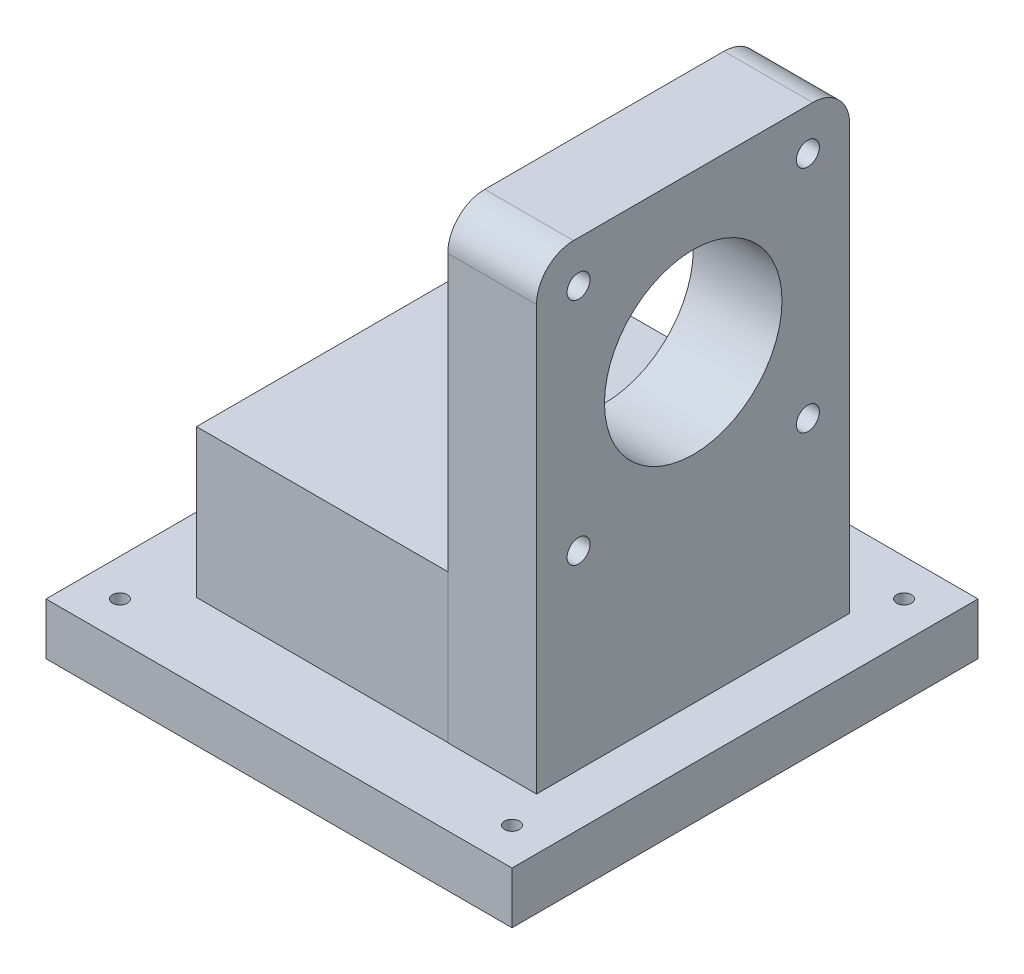
ISO-10303-21;
HEADER;
FILE_DESCRIPTION(('STEP AP214'),'2;1');
FILE_NAME('part.step','',(''),(''),'','','');
FILE_SCHEMA(('AUTOMOTIVE_DESIGN { 1 0 10303 214 1 1 1 1 }'));
ENDSEC;
DATA;
#1=APPLICATION_CONTEXT('core data for automotive mechanical design processes');
#2=APPLICATION_PROTOCOL_DEFINITION('international standard','automotive_design',2000,#1);
#3=PRODUCT_CONTEXT('',#1,'mechanical');
#4=PRODUCT('Part','Part','',(#3));
#5=PRODUCT_RELATED_PRODUCT_CATEGORY('part','',(#4));
#6=PRODUCT_DEFINITION_FORMATION('','',#4);
#7=PRODUCT_DEFINITION_CONTEXT('part definition',#1,'design');
#8=PRODUCT_DEFINITION('design','',#6,#7);
#9=PRODUCT_DEFINITION_SHAPE('','',#8);
#10=(LENGTH_UNIT() NAMED_UNIT(*) SI_UNIT(.MILLI.,.METRE.));
#11=(NAMED_UNIT(*) PLANE_ANGLE_UNIT() SI_UNIT($,.RADIAN.));
#12=(NAMED_UNIT(*) SI_UNIT($,.STERADIAN.) SOLID_ANGLE_UNIT());
#13=UNCERTAINTY_MEASURE_WITH_UNIT(LENGTH_MEASURE(1.E-05),#10,'distance_accuracy_value','');
#14=(GEOMETRIC_REPRESENTATION_CONTEXT(3) GLOBAL_UNCERTAINTY_ASSIGNED_CONTEXT((#13)) GLOBAL_UNIT_ASSIGNED_CONTEXT((#10,
#11,#12)) REPRESENTATION_CONTEXT('',''));
#15=CARTESIAN_POINT('',(0.,0.,0.));
#16=DIRECTION('',(0.,0.,1.));
#17=DIRECTION('',(1.,0.,0.));
#18=AXIS2_PLACEMENT_3D('',#15,#16,#17);
#19=CARTESIAN_POINT('',(0.,7.,0.));
#20=DIRECTION('',(0.,-1.,0.));
#21=DIRECTION('',(0.,0.,-1.));
#22=AXIS2_PLACEMENT_3D('',#19,#20,#21);
#23=PLANE('',#22);
#24=CARTESIAN_POINT('',(-22.,7.,26.5));
#25=DIRECTION('',(0.,1.,0.));
#26=DIRECTION('',(0.,0.,1.));
#27=AXIS2_PLACEMENT_3D('',#24,#25,#26);
#28=CIRCLE('',#27,1.);
#29=CARTESIAN_POINT('',(-22.,7.,27.5));
#30=VERTEX_POINT('',#29);
#31=EDGE_CURVE('E479',#30,#30,#28,.T.);
#32=ORIENTED_EDGE('',*,*,#31,.F.);
#33=EDGE_LOOP('',(#32));
#34=FACE_BOUND('',#33,.T.);
#35=CARTESIAN_POINT('',(31.,7.,26.5));
#36=DIRECTION('',(0.,1.,0.));
#37=DIRECTION('',(0.,0.,1.));
#38=AXIS2_PLACEMENT_3D('',#35,#36,#37);
#39=CIRCLE('',#38,0.999999999999995);
#40=CARTESIAN_POINT('',(31.,7.,27.5));
#41=VERTEX_POINT('',#40);
#42=EDGE_CURVE('E483',#41,#41,#39,.T.);
#43=ORIENTED_EDGE('',*,*,#42,.F.);
#44=EDGE_LOOP('',(#43));
#45=FACE_BOUND('',#44,.T.);
#46=CARTESIAN_POINT('',(31.,7.,-26.5));
#47=DIRECTION('',(0.,1.,0.));
#48=DIRECTION('',(0.,0.,1.));
#49=AXIS2_PLACEMENT_3D('',#46,#47,#48);
#50=CIRCLE('',#49,0.999999999999995);
#51=CARTESIAN_POINT('',(31.,7.,-25.5));
#52=VERTEX_POINT('',#51);
#53=EDGE_CURVE('E495',#52,#52,#50,.T.);
#54=ORIENTED_EDGE('',*,*,#53,.F.);
#55=EDGE_LOOP('',(#54));
#56=FACE_BOUND('',#55,.T.);
#57=CARTESIAN_POINT('',(-22.,7.,-26.5));
#58=DIRECTION('',(0.,1.,0.));
#59=DIRECTION('',(0.,0.,1.));
#60=AXIS2_PLACEMENT_3D('',#57,#58,#59);
#61=CIRCLE('',#60,1.);
#62=CARTESIAN_POINT('',(-22.,7.,-25.5));
#63=VERTEX_POINT('',#62);
#64=EDGE_CURVE('E488',#63,#63,#61,.T.);
#65=ORIENTED_EDGE('',*,*,#64,.F.);
#66=EDGE_LOOP('',(#65));
#67=FACE_BOUND('',#66,.T.);
#68=DIRECTION('',(0.,0.,-1.));
#69=VECTOR('',#68,1.);
#70=CARTESIAN_POINT('',(36.,7.,31.5));
#71=LINE('',#70,#69);
#72=CARTESIAN_POINT('',(36.,7.,31.5));
#73=VERTEX_POINT('',#72);
#74=CARTESIAN_POINT('',(36.,7.,-31.5));
#75=VERTEX_POINT('',#74);
#76=EDGE_CURVE('E189',#73,#75,#71,.T.);
#77=ORIENTED_EDGE('',*,*,#76,.T.);
#78=DIRECTION('',(-1.,0.,0.));
#79=VECTOR('',#78,1.);
#80=CARTESIAN_POINT('',(-27.,7.,-31.5));
#81=LINE('',#80,#79);
#82=CARTESIAN_POINT('',(-27.,7.,-31.5));
#83=VERTEX_POINT('',#82);
#84=EDGE_CURVE('E192',#75,#83,#81,.T.);
#85=ORIENTED_EDGE('',*,*,#84,.T.);
#86=DIRECTION('',(0.,0.,1.));
#87=VECTOR('',#86,1.);
#88=CARTESIAN_POINT('',(-27.,7.,31.5));
#89=LINE('',#88,#87);
#90=CARTESIAN_POINT('',(-27.,7.,31.5));
#91=VERTEX_POINT('',#90);
#92=EDGE_CURVE('E195',#83,#91,#89,.T.);
#93=ORIENTED_EDGE('',*,*,#92,.T.);
#94=DIRECTION('',(1.,0.,0.));
#95=VECTOR('',#94,1.);
#96=CARTESIAN_POINT('',(-27.,7.,31.5));
#97=LINE('',#96,#95);
#98=EDGE_CURVE('E197',#91,#73,#97,.T.);
#99=ORIENTED_EDGE('',*,*,#98,.T.);
#100=EDGE_LOOP('',(#77,#85,#93,#99));
#101=FACE_BOUND('',#100,.T.);
#102=DIRECTION('',(0.,0.,1.));
#103=VECTOR('',#102,1.);
#104=CARTESIAN_POINT('',(17.,7.,-21.15));
#105=LINE('',#104,#103);
#106=CARTESIAN_POINT('',(17.,7.,21.15));
#107=VERTEX_POINT('',#106);
#108=CARTESIAN_POINT('',(17.,7.,21.185));
#109=VERTEX_POINT('',#108);
#110=EDGE_CURVE('E141',#107,#109,#105,.T.);
#111=ORIENTED_EDGE('',*,*,#110,.F.);
#112=DIRECTION('',(1.,0.,0.));
#113=VECTOR('',#112,1.);
#114=CARTESIAN_POINT('',(-17.,7.,21.15));
#115=LINE('',#114,#113);
#116=CARTESIAN_POINT('',(-17.,7.,21.15));
#117=VERTEX_POINT('',#116);
#118=EDGE_CURVE('E168',#117,#107,#115,.T.);
#119=ORIENTED_EDGE('',*,*,#118,.F.);
#120=DIRECTION('',(0.,0.,1.));
#121=VECTOR('',#120,1.);
#122=CARTESIAN_POINT('',(-17.,7.,21.15));
#123=LINE('',#122,#121);
#124=CARTESIAN_POINT('',(-17.,7.,-21.15));
#125=VERTEX_POINT('',#124);
#126=EDGE_CURVE('E177',#125,#117,#123,.T.);
#127=ORIENTED_EDGE('',*,*,#126,.F.);
#128=DIRECTION('',(-1.,0.,0.));
#129=VECTOR('',#128,1.);
#130=CARTESIAN_POINT('',(-17.,7.,-21.15));
#131=LINE('',#130,#129);
#132=CARTESIAN_POINT('',(29.,7.,-21.15));
#133=VERTEX_POINT('',#132);
#134=EDGE_CURVE('E137',#133,#125,#131,.T.);
#135=ORIENTED_EDGE('',*,*,#134,.F.);
#136=DIRECTION('',(0.,0.,-1.));
#137=VECTOR('',#136,1.);
#138=CARTESIAN_POINT('',(29.,7.,-21.15));
#139=LINE('',#138,#137);
#140=CARTESIAN_POINT('',(29.,7.,21.185));
#141=VERTEX_POINT('',#140);
#142=EDGE_CURVE('E152',#141,#133,#139,.T.);
#143=ORIENTED_EDGE('',*,*,#142,.F.);
#144=DIRECTION('',(1.,0.,0.));
#145=VECTOR('',#144,1.);
#146=CARTESIAN_POINT('',(17.,7.,21.185));
#147=LINE('',#146,#145);
#148=EDGE_CURVE('E132',#109,#141,#147,.T.);
#149=ORIENTED_EDGE('',*,*,#148,.F.);
#150=EDGE_LOOP('',(#111,#119,#127,#135,#143,#149));
#151=FACE_BOUND('',#150,.T.);
#152=ADVANCED_FACE('F33',(#34,#45,#56,#67,#101,#151),#23,.F.);
#153=CARTESIAN_POINT('',(36.,7.,31.5));
#154=DIRECTION('',(-1.,0.,0.));
#155=DIRECTION('',(0.,0.,1.));
#156=AXIS2_PLACEMENT_3D('',#153,#154,#155);
#157=PLANE('',#156);
#158=DIRECTION('',(0.,0.,-1.));
#159=VECTOR('',#158,1.);
#160=CARTESIAN_POINT('',(36.,0.,31.5));
#161=LINE('',#160,#159);
#162=CARTESIAN_POINT('',(36.,0.,31.5));
#163=VERTEX_POINT('',#162);
#164=CARTESIAN_POINT('',(36.,0.,-31.5));
#165=VERTEX_POINT('',#164);
#166=EDGE_CURVE('E188',#163,#165,#161,.T.);
#167=ORIENTED_EDGE('',*,*,#166,.T.);
#168=DIRECTION('',(0.,-1.,0.));
#169=VECTOR('',#168,1.);
#170=CARTESIAN_POINT('',(36.,7.,-31.5));
#171=LINE('',#170,#169);
#172=EDGE_CURVE('E215',#75,#165,#171,.T.);
#173=ORIENTED_EDGE('',*,*,#172,.F.);
#174=ORIENTED_EDGE('',*,*,#76,.F.);
#175=DIRECTION('',(0.,-1.,0.));
#176=VECTOR('',#175,1.);
#177=CARTESIAN_POINT('',(36.,7.,31.5));
#178=LINE('',#177,#176);
#179=EDGE_CURVE('E199',#73,#163,#178,.T.);
#180=ORIENTED_EDGE('',*,*,#179,.T.);
#181=EDGE_LOOP('',(#167,#173,#174,#180));
#182=FACE_BOUND('',#181,.T.);
#183=ADVANCED_FACE('F261',(#182),#157,.F.);
#184=CARTESIAN_POINT('',(-27.,7.,-31.5));
#185=DIRECTION('',(0.,0.,1.));
#186=DIRECTION('',(1.,0.,0.));
#187=AXIS2_PLACEMENT_3D('',#184,#185,#186);
#188=PLANE('',#187);
#189=DIRECTION('',(-1.,0.,0.));
#190=VECTOR('',#189,1.);
#191=CARTESIAN_POINT('',(-27.,0.,-31.5));
#192=LINE('',#191,#190);
#193=CARTESIAN_POINT('',(-27.,0.,-31.5));
#194=VERTEX_POINT('',#193);
#195=EDGE_CURVE('E202',#165,#194,#192,.T.);
#196=ORIENTED_EDGE('',*,*,#195,.T.);
#197=DIRECTION('',(0.,-1.,0.));
#198=VECTOR('',#197,1.);
#199=CARTESIAN_POINT('',(-27.,7.,-31.5));
#200=LINE('',#199,#198);
#201=EDGE_CURVE('E212',#83,#194,#200,.T.);
#202=ORIENTED_EDGE('',*,*,#201,.F.);
#203=ORIENTED_EDGE('',*,*,#84,.F.);
#204=ORIENTED_EDGE('',*,*,#172,.T.);
#205=EDGE_LOOP('',(#196,#202,#203,#204));
#206=FACE_BOUND('',#205,.T.);
#207=ADVANCED_FACE('F267',(#206),#188,.F.);
#208=CARTESIAN_POINT('',(-27.,7.,31.5));
#209=DIRECTION('',(1.,0.,0.));
#210=DIRECTION('',(0.,0.,-1.));
#211=AXIS2_PLACEMENT_3D('',#208,#209,#210);
#212=PLANE('',#211);
#213=DIRECTION('',(0.,0.,1.));
#214=VECTOR('',#213,1.);
#215=CARTESIAN_POINT('',(-27.,0.,31.5));
#216=LINE('',#215,#214);
#217=CARTESIAN_POINT('',(-27.,0.,31.5));
#218=VERTEX_POINT('',#217);
#219=EDGE_CURVE('E204',#194,#218,#216,.T.);
#220=ORIENTED_EDGE('',*,*,#219,.T.);
#221=DIRECTION('',(0.,-1.,0.));
#222=VECTOR('',#221,1.);
#223=CARTESIAN_POINT('',(-27.,7.,31.5));
#224=LINE('',#223,#222);
#225=EDGE_CURVE('E209',#91,#218,#224,.T.);
#226=ORIENTED_EDGE('',*,*,#225,.F.);
#227=ORIENTED_EDGE('',*,*,#92,.F.);
#228=ORIENTED_EDGE('',*,*,#201,.T.);
#229=EDGE_LOOP('',(#220,#226,#227,#228));
#230=FACE_BOUND('',#229,.T.);
#231=ADVANCED_FACE('F279',(#230),#212,.F.);
#232=CARTESIAN_POINT('',(-27.,7.,31.5));
#233=DIRECTION('',(0.,0.,-1.));
#234=DIRECTION('',(-1.,0.,0.));
#235=AXIS2_PLACEMENT_3D('',#232,#233,#234);
#236=PLANE('',#235);
#237=DIRECTION('',(1.,0.,0.));
#238=VECTOR('',#237,1.);
#239=CARTESIAN_POINT('',(-27.,0.,31.5));
#240=LINE('',#239,#238);
#241=EDGE_CURVE('E193',#218,#163,#240,.T.);
#242=ORIENTED_EDGE('',*,*,#241,.T.);
#243=ORIENTED_EDGE('',*,*,#179,.F.);
#244=ORIENTED_EDGE('',*,*,#98,.F.);
#245=ORIENTED_EDGE('',*,*,#225,.T.);
#246=EDGE_LOOP('',(#242,#243,#244,#245));
#247=FACE_BOUND('',#246,.T.);
#248=ADVANCED_FACE('F275',(#247),#236,.F.);
#249=CARTESIAN_POINT('',(0.,0.,0.));
#250=DIRECTION('',(0.,-1.,0.));
#251=DIRECTION('',(0.,0.,-1.));
#252=AXIS2_PLACEMENT_3D('',#249,#250,#251);
#253=PLANE('',#252);
#254=CARTESIAN_POINT('',(-22.,0.,26.5));
#255=DIRECTION('',(0.,-1.,0.));
#256=DIRECTION('',(0.,0.,-1.));
#257=AXIS2_PLACEMENT_3D('',#254,#255,#256);
#258=CIRCLE('',#257,1.);
#259=CARTESIAN_POINT('',(-22.,0.,25.5));
#260=VERTEX_POINT('',#259);
#261=EDGE_CURVE('E477',#260,#260,#258,.F.);
#262=ORIENTED_EDGE('',*,*,#261,.T.);
#263=EDGE_LOOP('',(#262));
#264=FACE_BOUND('',#263,.T.);
#265=CARTESIAN_POINT('',(31.,0.,26.5));
#266=DIRECTION('',(0.,-1.,0.));
#267=DIRECTION('',(0.,0.,-1.));
#268=AXIS2_PLACEMENT_3D('',#265,#266,#267);
#269=CIRCLE('',#268,0.999999999999995);
#270=CARTESIAN_POINT('',(31.,0.,25.5));
#271=VERTEX_POINT('',#270);
#272=EDGE_CURVE('E480',#271,#271,#269,.F.);
#273=ORIENTED_EDGE('',*,*,#272,.T.);
#274=EDGE_LOOP('',(#273));
#275=FACE_BOUND('',#274,.T.);
#276=CARTESIAN_POINT('',(31.,0.,-26.5));
#277=DIRECTION('',(0.,-1.,0.));
#278=DIRECTION('',(0.,0.,-1.));
#279=AXIS2_PLACEMENT_3D('',#276,#277,#278);
#280=CIRCLE('',#279,0.999999999999995);
#281=CARTESIAN_POINT('',(31.,0.,-27.5));
#282=VERTEX_POINT('',#281);
#283=EDGE_CURVE('E548',#282,#282,#280,.F.);
#284=ORIENTED_EDGE('',*,*,#283,.T.);
#285=EDGE_LOOP('',(#284));
#286=FACE_BOUND('',#285,.T.);
#287=CARTESIAN_POINT('',(-22.,0.,-26.5));
#288=DIRECTION('',(0.,-1.,0.));
#289=DIRECTION('',(0.,0.,-1.));
#290=AXIS2_PLACEMENT_3D('',#287,#288,#289);
#291=CIRCLE('',#290,1.);
#292=CARTESIAN_POINT('',(-22.,0.,-27.5));
#293=VERTEX_POINT('',#292);
#294=EDGE_CURVE('E492',#293,#293,#291,.F.);
#295=ORIENTED_EDGE('',*,*,#294,.T.);
#296=EDGE_LOOP('',(#295));
#297=FACE_BOUND('',#296,.T.);
#298=ORIENTED_EDGE('',*,*,#166,.F.);
#299=ORIENTED_EDGE('',*,*,#241,.F.);
#300=ORIENTED_EDGE('',*,*,#219,.F.);
#301=ORIENTED_EDGE('',*,*,#195,.F.);
#302=EDGE_LOOP('',(#298,#299,#300,#301));
#303=FACE_BOUND('',#302,.T.);
#304=ADVANCED_FACE('F258',(#264,#275,#286,#297,#303),#253,.T.);
#305=CARTESIAN_POINT('',(-17.,27.,-21.15));
#306=DIRECTION('',(0.,0.,1.));
#307=DIRECTION('',(1.,0.,0.));
#308=AXIS2_PLACEMENT_3D('',#305,#306,#307);
#309=PLANE('',#308);
#310=DIRECTION('',(0.,-1.,0.));
#311=VECTOR('',#310,1.);
#312=CARTESIAN_POINT('',(17.,69.3,-21.15));
#313=LINE('',#312,#311);
#314=CARTESIAN_POINT('',(17.,64.3,-21.15));
#315=VERTEX_POINT('',#314);
#316=CARTESIAN_POINT('',(17.,27.,-21.15));
#317=VERTEX_POINT('',#316);
#318=EDGE_CURVE('E158',#315,#317,#313,.T.);
#319=ORIENTED_EDGE('',*,*,#318,.F.);
#320=DIRECTION('',(-1.,0.,0.));
#321=VECTOR('',#320,1.);
#322=CARTESIAN_POINT('',(29.,64.3,-21.15));
#323=LINE('',#322,#321);
#324=CARTESIAN_POINT('',(29.,64.3,-21.15));
#325=VERTEX_POINT('',#324);
#326=EDGE_CURVE('E56',#315,#325,#323,.F.);
#327=ORIENTED_EDGE('',*,*,#326,.T.);
#328=DIRECTION('',(0.,-1.,0.));
#329=VECTOR('',#328,1.);
#330=CARTESIAN_POINT('',(29.,69.3,-21.15));
#331=LINE('',#330,#329);
#332=EDGE_CURVE('E160',#325,#133,#331,.T.);
#333=ORIENTED_EDGE('',*,*,#332,.T.);
#334=ORIENTED_EDGE('',*,*,#134,.T.);
#335=DIRECTION('',(0.,-1.,0.));
#336=VECTOR('',#335,1.);
#337=CARTESIAN_POINT('',(-17.,27.,-21.15));
#338=LINE('',#337,#336);
#339=CARTESIAN_POINT('',(-17.,27.,-21.15));
#340=VERTEX_POINT('',#339);
#341=EDGE_CURVE('E185',#340,#125,#338,.T.);
#342=ORIENTED_EDGE('',*,*,#341,.F.);
#343=DIRECTION('',(-1.,0.,0.));
#344=VECTOR('',#343,1.);
#345=CARTESIAN_POINT('',(-17.,27.,-21.15));
#346=LINE('',#345,#344);
#347=EDGE_CURVE('E167',#317,#340,#346,.T.);
#348=ORIENTED_EDGE('',*,*,#347,.F.);
#349=EDGE_LOOP('',(#319,#327,#333,#334,#342,#348));
#350=FACE_BOUND('',#349,.T.);
#351=ADVANCED_FACE('F240',(#350),#309,.F.);
#352=CARTESIAN_POINT('',(-17.,27.,21.15));
#353=DIRECTION('',(1.,0.,0.));
#354=DIRECTION('',(0.,0.,-1.));
#355=AXIS2_PLACEMENT_3D('',#352,#353,#354);
#356=PLANE('',#355);
#357=ORIENTED_EDGE('',*,*,#126,.T.);
#358=DIRECTION('',(0.,-1.,0.));
#359=VECTOR('',#358,1.);
#360=CARTESIAN_POINT('',(-17.,27.,21.15));
#361=LINE('',#360,#359);
#362=CARTESIAN_POINT('',(-17.,27.,21.15));
#363=VERTEX_POINT('',#362);
#364=EDGE_CURVE('E182',#363,#117,#361,.T.);
#365=ORIENTED_EDGE('',*,*,#364,.F.);
#366=DIRECTION('',(0.,0.,1.));
#367=VECTOR('',#366,1.);
#368=CARTESIAN_POINT('',(-17.,27.,21.15));
#369=LINE('',#368,#367);
#370=EDGE_CURVE('E170',#340,#363,#369,.T.);
#371=ORIENTED_EDGE('',*,*,#370,.F.);
#372=ORIENTED_EDGE('',*,*,#341,.T.);
#373=EDGE_LOOP('',(#357,#365,#371,#372));
#374=FACE_BOUND('',#373,.T.);
#375=ADVANCED_FACE('F250',(#374),#356,.F.);
#376=CARTESIAN_POINT('',(-17.,27.,21.15));
#377=DIRECTION('',(0.,0.,-1.));
#378=DIRECTION('',(-1.,0.,0.));
#379=AXIS2_PLACEMENT_3D('',#376,#377,#378);
#380=PLANE('',#379);
#381=ORIENTED_EDGE('',*,*,#118,.T.);
#382=DIRECTION('',(0.,-1.,0.));
#383=VECTOR('',#382,1.);
#384=CARTESIAN_POINT('',(17.,27.,21.15));
#385=LINE('',#384,#383);
#386=CARTESIAN_POINT('',(17.,27.,21.15));
#387=VERTEX_POINT('',#386);
#388=EDGE_CURVE('E145',#387,#107,#385,.T.);
#389=ORIENTED_EDGE('',*,*,#388,.F.);
#390=DIRECTION('',(1.,0.,0.));
#391=VECTOR('',#390,1.);
#392=CARTESIAN_POINT('',(-17.,27.,21.15));
#393=LINE('',#392,#391);
#394=EDGE_CURVE('E172',#363,#387,#393,.T.);
#395=ORIENTED_EDGE('',*,*,#394,.F.);
#396=ORIENTED_EDGE('',*,*,#364,.T.);
#397=EDGE_LOOP('',(#381,#389,#395,#396));
#398=FACE_BOUND('',#397,.T.);
#399=ADVANCED_FACE('F248',(#398),#380,.F.);
#400=CARTESIAN_POINT('',(0.,27.,0.));
#401=DIRECTION('',(0.,-1.,0.));
#402=DIRECTION('',(0.,0.,-1.));
#403=AXIS2_PLACEMENT_3D('',#400,#401,#402);
#404=PLANE('',#403);
#405=DIRECTION('',(0.,0.,-1.));
#406=VECTOR('',#405,1.);
#407=CARTESIAN_POINT('',(17.,27.,21.15));
#408=LINE('',#407,#406);
#409=EDGE_CURVE('E164',#387,#317,#408,.T.);
#410=ORIENTED_EDGE('',*,*,#409,.T.);
#411=ORIENTED_EDGE('',*,*,#347,.T.);
#412=ORIENTED_EDGE('',*,*,#370,.T.);
#413=ORIENTED_EDGE('',*,*,#394,.T.);
#414=EDGE_LOOP('',(#410,#411,#412,#413));
#415=FACE_BOUND('',#414,.T.);
#416=ADVANCED_FACE('F244',(#415),#404,.F.);
#417=CARTESIAN_POINT('',(17.,69.3,-21.15));
#418=DIRECTION('',(1.,0.,0.));
#419=DIRECTION('',(0.,0.,-1.));
#420=AXIS2_PLACEMENT_3D('',#417,#418,#419);
#421=PLANE('',#420);
#422=CARTESIAN_POINT('',(17.,63.65,15.5));
#423=DIRECTION('',(1.,0.,0.));
#424=DIRECTION('',(0.,0.,-1.));
#425=AXIS2_PLACEMENT_3D('',#422,#423,#424);
#426=CIRCLE('',#425,1.55500000000001);
#427=CARTESIAN_POINT('',(17.,63.65,13.945));
#428=VERTEX_POINT('',#427);
#429=EDGE_CURVE('E148',#428,#428,#426,.T.);
#430=ORIENTED_EDGE('',*,*,#429,.T.);
#431=EDGE_LOOP('',(#430));
#432=FACE_BOUND('',#431,.T.);
#433=CARTESIAN_POINT('',(17.,63.65,-15.5));
#434=DIRECTION('',(1.,0.,0.));
#435=DIRECTION('',(0.,0.,-1.));
#436=AXIS2_PLACEMENT_3D('',#433,#434,#435);
#437=CIRCLE('',#436,1.555);
#438=CARTESIAN_POINT('',(17.,63.65,-17.055));
#439=VERTEX_POINT('',#438);
#440=EDGE_CURVE('E518',#439,#439,#437,.T.);
#441=ORIENTED_EDGE('',*,*,#440,.T.);
#442=EDGE_LOOP('',(#441));
#443=FACE_BOUND('',#442,.T.);
#444=CARTESIAN_POINT('',(17.,32.65,-15.5));
#445=DIRECTION('',(1.,0.,0.));
#446=DIRECTION('',(0.,0.,-1.));
#447=AXIS2_PLACEMENT_3D('',#444,#445,#446);
#448=CIRCLE('',#447,1.555);
#449=CARTESIAN_POINT('',(17.,32.65,-17.055));
#450=VERTEX_POINT('',#449);
#451=EDGE_CURVE('E515',#450,#450,#448,.T.);
#452=ORIENTED_EDGE('',*,*,#451,.T.);
#453=EDGE_LOOP('',(#452));
#454=FACE_BOUND('',#453,.T.);
#455=CARTESIAN_POINT('',(17.,32.65,15.5));
#456=DIRECTION('',(1.,0.,0.));
#457=DIRECTION('',(0.,0.,-1.));
#458=AXIS2_PLACEMENT_3D('',#455,#456,#457);
#459=CIRCLE('',#458,1.555);
#460=CARTESIAN_POINT('',(17.,32.65,13.945));
#461=VERTEX_POINT('',#460);
#462=EDGE_CURVE('E512',#461,#461,#459,.T.);
#463=ORIENTED_EDGE('',*,*,#462,.T.);
#464=EDGE_LOOP('',(#463));
#465=FACE_BOUND('',#464,.T.);
#466=CARTESIAN_POINT('',(17.,48.15,0.));
#467=DIRECTION('',(1.,0.,0.));
#468=DIRECTION('',(0.,0.,-1.));
#469=AXIS2_PLACEMENT_3D('',#466,#467,#468);
#470=CIRCLE('',#469,12.);
#471=CARTESIAN_POINT('',(17.,48.15,-12.));
#472=VERTEX_POINT('',#471);
#473=EDGE_CURVE('E509',#472,#472,#470,.T.);
#474=ORIENTED_EDGE('',*,*,#473,.T.);
#475=EDGE_LOOP('',(#474));
#476=FACE_BOUND('',#475,.T.);
#477=DIRECTION('',(0.,0.,1.));
#478=VECTOR('',#477,1.);
#479=CARTESIAN_POINT('',(17.,69.3,-21.15));
#480=LINE('',#479,#478);
#481=CARTESIAN_POINT('',(17.,69.3,-16.15));
#482=VERTEX_POINT('',#481);
#483=CARTESIAN_POINT('',(17.,69.3,16.185));
#484=VERTEX_POINT('',#483);
#485=EDGE_CURVE('E154',#482,#484,#480,.T.);
#486=ORIENTED_EDGE('',*,*,#485,.F.);
#487=CARTESIAN_POINT('',(17.,64.3,-16.15));
#488=DIRECTION('',(1.,0.,0.));
#489=DIRECTION('',(0.,0.,-1.));
#490=AXIS2_PLACEMENT_3D('',#487,#488,#489);
#491=CIRCLE('',#490,5.);
#492=EDGE_CURVE('E226',#482,#315,#491,.F.);
#493=ORIENTED_EDGE('',*,*,#492,.T.);
#494=ORIENTED_EDGE('',*,*,#318,.T.);
#495=ORIENTED_EDGE('',*,*,#409,.F.);
#496=ORIENTED_EDGE('',*,*,#388,.T.);
#497=ORIENTED_EDGE('',*,*,#110,.T.);
#498=DIRECTION('',(0.,-1.,0.));
#499=VECTOR('',#498,1.);
#500=CARTESIAN_POINT('',(17.,69.3,21.185));
#501=LINE('',#500,#499);
#502=CARTESIAN_POINT('',(17.,64.3,21.185));
#503=VERTEX_POINT('',#502);
#504=EDGE_CURVE('E128',#503,#109,#501,.T.);
#505=ORIENTED_EDGE('',*,*,#504,.F.);
#506=CARTESIAN_POINT('',(17.,64.3,16.185));
#507=DIRECTION('',(1.,0.,0.));
#508=DIRECTION('',(0.,0.,-1.));
#509=AXIS2_PLACEMENT_3D('',#506,#507,#508);
#510=CIRCLE('',#509,5.);
#511=EDGE_CURVE('E224',#503,#484,#510,.F.);
#512=ORIENTED_EDGE('',*,*,#511,.T.);
#513=EDGE_LOOP('',(#486,#493,#494,#495,#496,#497,#505,#512));
#514=FACE_BOUND('',#513,.T.);
#515=ADVANCED_FACE('F143',(#432,#443,#454,#465,#476,#514),#421,.F.);
#516=CARTESIAN_POINT('',(17.,69.3,21.185));
#517=DIRECTION('',(0.,0.,-1.));
#518=DIRECTION('',(-1.,0.,0.));
#519=AXIS2_PLACEMENT_3D('',#516,#517,#518);
#520=PLANE('',#519);
#521=DIRECTION('',(0.,-1.,0.));
#522=VECTOR('',#521,1.);
#523=CARTESIAN_POINT('',(29.,69.3,21.185));
#524=LINE('',#523,#522);
#525=CARTESIAN_POINT('',(29.,64.3,21.185));
#526=VERTEX_POINT('',#525);
#527=EDGE_CURVE('E138',#526,#141,#524,.T.);
#528=ORIENTED_EDGE('',*,*,#527,.F.);
#529=DIRECTION('',(1.,0.,0.));
#530=VECTOR('',#529,1.);
#531=CARTESIAN_POINT('',(17.,64.3,21.185));
#532=LINE('',#531,#530);
#533=EDGE_CURVE('E11',#526,#503,#532,.F.);
#534=ORIENTED_EDGE('',*,*,#533,.T.);
#535=ORIENTED_EDGE('',*,*,#504,.T.);
#536=ORIENTED_EDGE('',*,*,#148,.T.);
#537=EDGE_LOOP('',(#528,#534,#535,#536));
#538=FACE_BOUND('',#537,.T.);
#539=ADVANCED_FACE('F130',(#538),#520,.F.);
#540=CARTESIAN_POINT('',(29.,69.3,-21.15));
#541=DIRECTION('',(-1.,0.,0.));
#542=DIRECTION('',(0.,0.,1.));
#543=AXIS2_PLACEMENT_3D('',#540,#541,#542);
#544=PLANE('',#543);
#545=CARTESIAN_POINT('',(29.,63.65,15.5));
#546=DIRECTION('',(1.,0.,0.));
#547=DIRECTION('',(0.,0.,-1.));
#548=AXIS2_PLACEMENT_3D('',#545,#546,#547);
#549=CIRCLE('',#548,1.55500000000001);
#550=CARTESIAN_POINT('',(29.,63.65,13.945));
#551=VERTEX_POINT('',#550);
#552=EDGE_CURVE('E491',#551,#551,#549,.T.);
#553=ORIENTED_EDGE('',*,*,#552,.F.);
#554=EDGE_LOOP('',(#553));
#555=FACE_BOUND('',#554,.T.);
#556=CARTESIAN_POINT('',(29.,63.65,-15.5));
#557=DIRECTION('',(1.,0.,0.));
#558=DIRECTION('',(0.,0.,-1.));
#559=AXIS2_PLACEMENT_3D('',#556,#557,#558);
#560=CIRCLE('',#559,1.555);
#561=CARTESIAN_POINT('',(29.,63.65,-17.055));
#562=VERTEX_POINT('',#561);
#563=EDGE_CURVE('E503',#562,#562,#560,.T.);
#564=ORIENTED_EDGE('',*,*,#563,.F.);
#565=EDGE_LOOP('',(#564));
#566=FACE_BOUND('',#565,.T.);
#567=CARTESIAN_POINT('',(29.,32.65,-15.5));
#568=DIRECTION('',(1.,0.,0.));
#569=DIRECTION('',(0.,0.,-1.));
#570=AXIS2_PLACEMENT_3D('',#567,#568,#569);
#571=CIRCLE('',#570,1.555);
#572=CARTESIAN_POINT('',(29.,32.65,-17.055));
#573=VERTEX_POINT('',#572);
#574=EDGE_CURVE('E500',#573,#573,#571,.T.);
#575=ORIENTED_EDGE('',*,*,#574,.F.);
#576=EDGE_LOOP('',(#575));
#577=FACE_BOUND('',#576,.T.);
#578=CARTESIAN_POINT('',(29.,32.65,15.5));
#579=DIRECTION('',(1.,0.,0.));
#580=DIRECTION('',(0.,0.,-1.));
#581=AXIS2_PLACEMENT_3D('',#578,#579,#580);
#582=CIRCLE('',#581,1.555);
#583=CARTESIAN_POINT('',(29.,32.65,13.945));
#584=VERTEX_POINT('',#583);
#585=EDGE_CURVE('E496',#584,#584,#582,.T.);
#586=ORIENTED_EDGE('',*,*,#585,.F.);
#587=EDGE_LOOP('',(#586));
#588=FACE_BOUND('',#587,.T.);
#589=CARTESIAN_POINT('',(29.,48.15,0.));
#590=DIRECTION('',(1.,0.,0.));
#591=DIRECTION('',(0.,0.,-1.));
#592=AXIS2_PLACEMENT_3D('',#589,#590,#591);
#593=CIRCLE('',#592,12.);
#594=CARTESIAN_POINT('',(29.,48.15,-12.));
#595=VERTEX_POINT('',#594);
#596=EDGE_CURVE('E499',#595,#595,#593,.T.);
#597=ORIENTED_EDGE('',*,*,#596,.F.);
#598=EDGE_LOOP('',(#597));
#599=FACE_BOUND('',#598,.T.);
#600=ORIENTED_EDGE('',*,*,#332,.F.);
#601=CARTESIAN_POINT('',(29.,64.3,-16.15));
#602=DIRECTION('',(-1.,0.,0.));
#603=DIRECTION('',(0.,0.,1.));
#604=AXIS2_PLACEMENT_3D('',#601,#602,#603);
#605=CIRCLE('',#604,5.);
#606=CARTESIAN_POINT('',(29.,69.3,-16.15));
#607=VERTEX_POINT('',#606);
#608=EDGE_CURVE('E41',#325,#607,#605,.F.);
#609=ORIENTED_EDGE('',*,*,#608,.T.);
#610=DIRECTION('',(0.,0.,-1.));
#611=VECTOR('',#610,1.);
#612=CARTESIAN_POINT('',(29.,69.3,-21.15));
#613=LINE('',#612,#611);
#614=CARTESIAN_POINT('',(29.,69.3,16.185));
#615=VERTEX_POINT('',#614);
#616=EDGE_CURVE('E161',#615,#607,#613,.T.);
#617=ORIENTED_EDGE('',*,*,#616,.F.);
#618=CARTESIAN_POINT('',(29.,64.3,16.185));
#619=DIRECTION('',(-1.,0.,0.));
#620=DIRECTION('',(0.,0.,1.));
#621=AXIS2_PLACEMENT_3D('',#618,#619,#620);
#622=CIRCLE('',#621,5.);
#623=EDGE_CURVE('E48',#615,#526,#622,.F.);
#624=ORIENTED_EDGE('',*,*,#623,.T.);
#625=ORIENTED_EDGE('',*,*,#527,.T.);
#626=ORIENTED_EDGE('',*,*,#142,.T.);
#627=EDGE_LOOP('',(#600,#609,#617,#624,#625,#626));
#628=FACE_BOUND('',#627,.T.);
#629=ADVANCED_FACE('F231',(#555,#566,#577,#588,#599,#628),#544,.F.);
#630=CARTESIAN_POINT('',(0.,69.3,0.));
#631=DIRECTION('',(0.,1.,0.));
#632=DIRECTION('',(0.,0.,1.));
#633=AXIS2_PLACEMENT_3D('',#630,#631,#632);
#634=PLANE('',#633);
#635=ORIENTED_EDGE('',*,*,#616,.T.);
#636=DIRECTION('',(-1.,0.,0.));
#637=VECTOR('',#636,1.);
#638=CARTESIAN_POINT('',(17.,69.3,-16.15));
#639=LINE('',#638,#637);
#640=EDGE_CURVE('E221',#607,#482,#639,.T.);
#641=ORIENTED_EDGE('',*,*,#640,.T.);
#642=ORIENTED_EDGE('',*,*,#485,.T.);
#643=DIRECTION('',(1.,0.,0.));
#644=VECTOR('',#643,1.);
#645=CARTESIAN_POINT('',(29.,69.3,16.185));
#646=LINE('',#645,#644);
#647=EDGE_CURVE('E218',#484,#615,#646,.T.);
#648=ORIENTED_EDGE('',*,*,#647,.T.);
#649=EDGE_LOOP('',(#635,#641,#642,#648));
#650=FACE_BOUND('',#649,.T.);
#651=ADVANCED_FACE('F235',(#650),#634,.T.);
#652=CARTESIAN_POINT('',(-21.,48.15,0.));
#653=DIRECTION('',(1.,0.,0.));
#654=DIRECTION('',(0.,0.,-1.));
#655=AXIS2_PLACEMENT_3D('',#652,#653,#654);
#656=CYLINDRICAL_SURFACE('',#655,12.);
#657=ORIENTED_EDGE('',*,*,#596,.T.);
#658=EDGE_LOOP('',(#657));
#659=FACE_BOUND('',#658,.T.);
#660=ORIENTED_EDGE('',*,*,#473,.F.);
#661=EDGE_LOOP('',(#660));
#662=FACE_BOUND('',#661,.T.);
#663=ADVANCED_FACE('F307',(#659,#662),#656,.F.);
#664=CARTESIAN_POINT('',(-21.,32.65,15.5));
#665=DIRECTION('',(1.,0.,0.));
#666=DIRECTION('',(0.,0.,-1.));
#667=AXIS2_PLACEMENT_3D('',#664,#665,#666);
#668=CYLINDRICAL_SURFACE('',#667,1.555);
#669=ORIENTED_EDGE('',*,*,#585,.T.);
#670=EDGE_LOOP('',(#669));
#671=FACE_BOUND('',#670,.T.);
#672=ORIENTED_EDGE('',*,*,#462,.F.);
#673=EDGE_LOOP('',(#672));
#674=FACE_BOUND('',#673,.T.);
#675=ADVANCED_FACE('F310',(#671,#674),#668,.F.);
#676=CARTESIAN_POINT('',(-21.,32.65,-15.5));
#677=DIRECTION('',(1.,0.,0.));
#678=DIRECTION('',(0.,0.,-1.));
#679=AXIS2_PLACEMENT_3D('',#676,#677,#678);
#680=CYLINDRICAL_SURFACE('',#679,1.555);
#681=ORIENTED_EDGE('',*,*,#574,.T.);
#682=EDGE_LOOP('',(#681));
#683=FACE_BOUND('',#682,.T.);
#684=ORIENTED_EDGE('',*,*,#451,.F.);
#685=EDGE_LOOP('',(#684));
#686=FACE_BOUND('',#685,.T.);
#687=ADVANCED_FACE('F300',(#683,#686),#680,.F.);
#688=CARTESIAN_POINT('',(-21.,63.65,-15.5));
#689=DIRECTION('',(1.,0.,0.));
#690=DIRECTION('',(0.,0.,-1.));
#691=AXIS2_PLACEMENT_3D('',#688,#689,#690);
#692=CYLINDRICAL_SURFACE('',#691,1.555);
#693=ORIENTED_EDGE('',*,*,#563,.T.);
#694=EDGE_LOOP('',(#693));
#695=FACE_BOUND('',#694,.T.);
#696=ORIENTED_EDGE('',*,*,#440,.F.);
#697=EDGE_LOOP('',(#696));
#698=FACE_BOUND('',#697,.T.);
#699=ADVANCED_FACE('F294',(#695,#698),#692,.F.);
#700=CARTESIAN_POINT('',(-21.,63.65,15.5));
#701=DIRECTION('',(1.,0.,0.));
#702=DIRECTION('',(0.,0.,-1.));
#703=AXIS2_PLACEMENT_3D('',#700,#701,#702);
#704=CYLINDRICAL_SURFACE('',#703,1.55500000000001);
#705=ORIENTED_EDGE('',*,*,#552,.T.);
#706=EDGE_LOOP('',(#705));
#707=FACE_BOUND('',#706,.T.);
#708=ORIENTED_EDGE('',*,*,#429,.F.);
#709=EDGE_LOOP('',(#708));
#710=FACE_BOUND('',#709,.T.);
#711=ADVANCED_FACE('F287',(#707,#710),#704,.F.);
#712=CARTESIAN_POINT('',(0.,64.3,-16.15));
#713=DIRECTION('',(1.,0.,0.));
#714=DIRECTION('',(0.,0.,-1.));
#715=AXIS2_PLACEMENT_3D('',#712,#713,#714);
#716=CYLINDRICAL_SURFACE('',#715,5.);
#717=ORIENTED_EDGE('',*,*,#608,.F.);
#718=ORIENTED_EDGE('',*,*,#326,.F.);
#719=ORIENTED_EDGE('',*,*,#492,.F.);
#720=ORIENTED_EDGE('',*,*,#640,.F.);
#721=EDGE_LOOP('',(#717,#718,#719,#720));
#722=FACE_BOUND('',#721,.T.);
#723=ADVANCED_FACE('F238',(#722),#716,.T.);
#724=CARTESIAN_POINT('',(0.,64.3,16.185));
#725=DIRECTION('',(-1.,0.,0.));
#726=DIRECTION('',(0.,0.,1.));
#727=AXIS2_PLACEMENT_3D('',#724,#725,#726);
#728=CYLINDRICAL_SURFACE('',#727,5.);
#729=ORIENTED_EDGE('',*,*,#511,.F.);
#730=ORIENTED_EDGE('',*,*,#533,.F.);
#731=ORIENTED_EDGE('',*,*,#623,.F.);
#732=ORIENTED_EDGE('',*,*,#647,.F.);
#733=EDGE_LOOP('',(#729,#730,#731,#732));
#734=FACE_BOUND('',#733,.T.);
#735=ADVANCED_FACE('F35',(#734),#728,.T.);
#736=CARTESIAN_POINT('',(-22.,-0.00100000000000013,-26.5));
#737=DIRECTION('',(0.,1.,0.));
#738=DIRECTION('',(0.,0.,1.));
#739=AXIS2_PLACEMENT_3D('',#736,#737,#738);
#740=CYLINDRICAL_SURFACE('',#739,1.);
#741=ORIENTED_EDGE('',*,*,#294,.F.);
#742=EDGE_LOOP('',(#741));
#743=FACE_BOUND('',#742,.T.);
#744=ORIENTED_EDGE('',*,*,#64,.T.);
#745=EDGE_LOOP('',(#744));
#746=FACE_BOUND('',#745,.T.);
#747=ADVANCED_FACE('F292',(#743,#746),#740,.F.);
#748=CARTESIAN_POINT('',(31.,-0.00100000000000013,-26.5));
#749=DIRECTION('',(0.,1.,0.));
#750=DIRECTION('',(0.,0.,1.));
#751=AXIS2_PLACEMENT_3D('',#748,#749,#750);
#752=CYLINDRICAL_SURFACE('',#751,0.999999999999995);
#753=ORIENTED_EDGE('',*,*,#283,.F.);
#754=EDGE_LOOP('',(#753));
#755=FACE_BOUND('',#754,.T.);
#756=ORIENTED_EDGE('',*,*,#53,.T.);
#757=EDGE_LOOP('',(#756));
#758=FACE_BOUND('',#757,.T.);
#759=ADVANCED_FACE('F440',(#755,#758),#752,.F.);
#760=CARTESIAN_POINT('',(31.,-0.00100000000000013,26.5));
#761=DIRECTION('',(0.,1.,0.));
#762=DIRECTION('',(0.,0.,1.));
#763=AXIS2_PLACEMENT_3D('',#760,#761,#762);
#764=CYLINDRICAL_SURFACE('',#763,0.999999999999995);
#765=ORIENTED_EDGE('',*,*,#272,.F.);
#766=EDGE_LOOP('',(#765));
#767=FACE_BOUND('',#766,.T.);
#768=ORIENTED_EDGE('',*,*,#42,.T.);
#769=EDGE_LOOP('',(#768));
#770=FACE_BOUND('',#769,.T.);
#771=ADVANCED_FACE('F447',(#767,#770),#764,.F.);
#772=CARTESIAN_POINT('',(-22.,-0.00100000000000013,26.5));
#773=DIRECTION('',(0.,1.,0.));
#774=DIRECTION('',(0.,0.,1.));
#775=AXIS2_PLACEMENT_3D('',#772,#773,#774);
#776=CYLINDRICAL_SURFACE('',#775,1.);
#777=ORIENTED_EDGE('',*,*,#261,.F.);
#778=EDGE_LOOP('',(#777));
#779=FACE_BOUND('',#778,.T.);
#780=ORIENTED_EDGE('',*,*,#31,.T.);
#781=EDGE_LOOP('',(#780));
#782=FACE_BOUND('',#781,.T.);
#783=ADVANCED_FACE('F455',(#779,#782),#776,.F.);
#784=CLOSED_SHELL('',(#152,#183,#207,#231,#248,#304,#351,#375,#399,#416,#515,#539,#629,#651,
#663,#675,#687,#699,#711,#723,#735,#747,#759,#771,#783));
#785=MANIFOLD_SOLID_BREP('B2',#784);
#786=ADVANCED_BREP_SHAPE_REPRESENTATION('',(#18,#785),#14);
#787=SHAPE_DEFINITION_REPRESENTATION(#9,#786);
ENDSEC;
END-ISO-10303-21;
